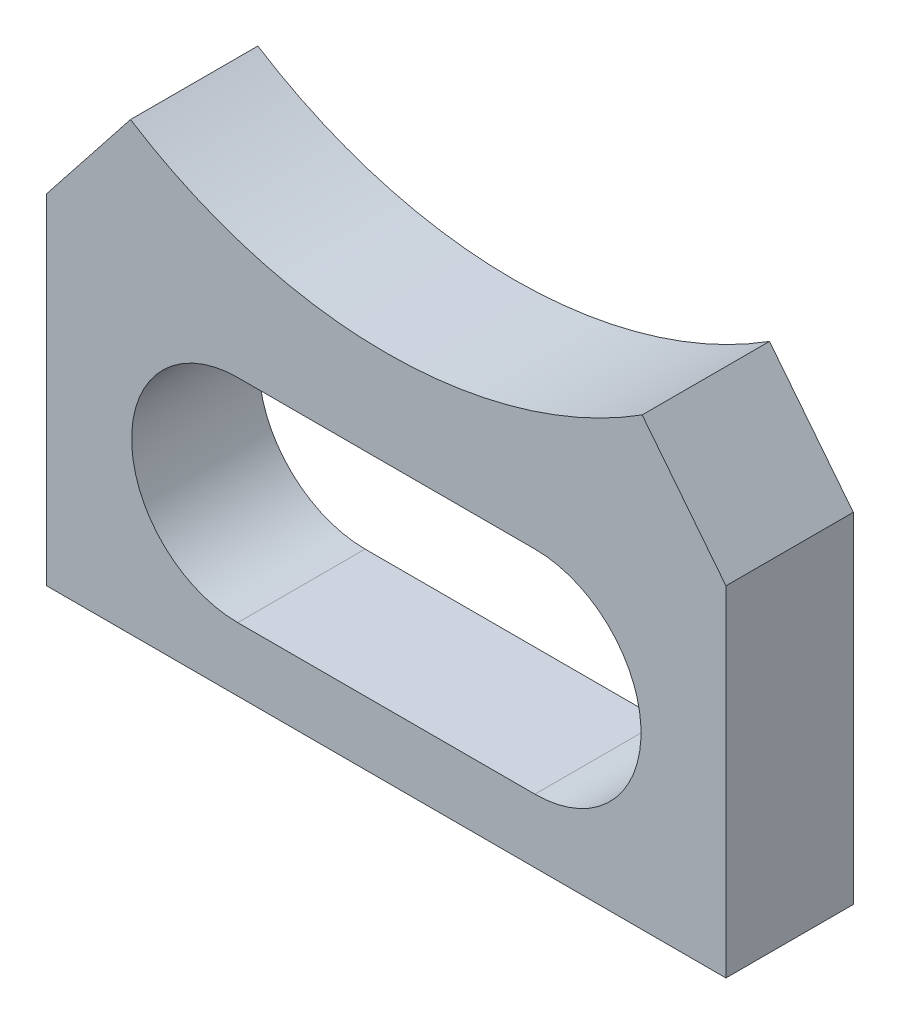
ISO-10303-21;
HEADER;
FILE_DESCRIPTION(('STEP AP214'),'2;1');
FILE_NAME('part.step','',(''),(''),'','','');
FILE_SCHEMA(('AUTOMOTIVE_DESIGN { 1 0 10303 214 1 1 1 1 }'));
ENDSEC;
DATA;
#1=APPLICATION_CONTEXT('core data for automotive mechanical design processes');
#2=APPLICATION_PROTOCOL_DEFINITION('international standard','automotive_design',2000,#1);
#3=PRODUCT_CONTEXT('',#1,'mechanical');
#4=PRODUCT('Part','Part','',(#3));
#5=PRODUCT_RELATED_PRODUCT_CATEGORY('part','',(#4));
#6=PRODUCT_DEFINITION_FORMATION('','',#4);
#7=PRODUCT_DEFINITION_CONTEXT('part definition',#1,'design');
#8=PRODUCT_DEFINITION('design','',#6,#7);
#9=PRODUCT_DEFINITION_SHAPE('','',#8);
#10=(LENGTH_UNIT() NAMED_UNIT(*) SI_UNIT(.MILLI.,.METRE.));
#11=(NAMED_UNIT(*) PLANE_ANGLE_UNIT() SI_UNIT($,.RADIAN.));
#12=(NAMED_UNIT(*) SI_UNIT($,.STERADIAN.) SOLID_ANGLE_UNIT());
#13=UNCERTAINTY_MEASURE_WITH_UNIT(LENGTH_MEASURE(1.E-05),#10,'distance_accuracy_value','');
#14=(GEOMETRIC_REPRESENTATION_CONTEXT(3) GLOBAL_UNCERTAINTY_ASSIGNED_CONTEXT((#13)) GLOBAL_UNIT_ASSIGNED_CONTEXT((#10,
#11,#12)) REPRESENTATION_CONTEXT('',''));
#15=CARTESIAN_POINT('',(0.,0.,0.));
#16=DIRECTION('',(0.,0.,1.));
#17=DIRECTION('',(1.,0.,0.));
#18=AXIS2_PLACEMENT_3D('',#15,#16,#17);
#19=CARTESIAN_POINT('',(-16.,0.,-6.));
#20=DIRECTION('',(-1.,0.,0.));
#21=DIRECTION('',(0.,0.,1.));
#22=AXIS2_PLACEMENT_3D('',#19,#20,#21);
#23=PLANE('',#22);
#24=DIRECTION('',(0.,-1.,0.));
#25=VECTOR('',#24,1.);
#26=CARTESIAN_POINT('',(-16.,0.,0.));
#27=LINE('',#26,#25);
#28=CARTESIAN_POINT('',(-16.,16.,0.));
#29=VERTEX_POINT('',#28);
#30=CARTESIAN_POINT('',(-16.,0.,0.));
#31=VERTEX_POINT('',#30);
#32=EDGE_CURVE('E146',#29,#31,#27,.T.);
#33=ORIENTED_EDGE('',*,*,#32,.F.);
#34=DIRECTION('',(0.,0.,1.));
#35=VECTOR('',#34,1.);
#36=CARTESIAN_POINT('',(-16.,16.,-6.));
#37=LINE('',#36,#35);
#38=CARTESIAN_POINT('',(-16.,16.,-6.));
#39=VERTEX_POINT('',#38);
#40=EDGE_CURVE('E11',#39,#29,#37,.T.);
#41=ORIENTED_EDGE('',*,*,#40,.F.);
#42=DIRECTION('',(0.,-1.,0.));
#43=VECTOR('',#42,1.);
#44=CARTESIAN_POINT('',(-16.,0.,-6.));
#45=LINE('',#44,#43);
#46=CARTESIAN_POINT('',(-16.,0.,-6.));
#47=VERTEX_POINT('',#46);
#48=EDGE_CURVE('E150',#39,#47,#45,.T.);
#49=ORIENTED_EDGE('',*,*,#48,.T.);
#50=DIRECTION('',(0.,0.,1.));
#51=VECTOR('',#50,1.);
#52=CARTESIAN_POINT('',(-16.,0.,-6.));
#53=LINE('',#52,#51);
#54=EDGE_CURVE('E39',#47,#31,#53,.T.);
#55=ORIENTED_EDGE('',*,*,#54,.T.);
#56=EDGE_LOOP('',(#33,#41,#49,#55));
#57=FACE_BOUND('',#56,.T.);
#58=ADVANCED_FACE('F36',(#57),#23,.T.);
#59=CARTESIAN_POINT('',(-16.,16.,-6.));
#60=DIRECTION('',(-0.784832318320194,0.619708183034685,0.));
#61=DIRECTION('',(-0.619708183034685,-0.784832318320194,0.));
#62=AXIS2_PLACEMENT_3D('',#59,#60,#61);
#63=PLANE('',#62);
#64=DIRECTION('',(-0.619708183034685,-0.784832318320194,0.));
#65=VECTOR('',#64,1.);
#66=CARTESIAN_POINT('',(-16.,16.,0.));
#67=LINE('',#66,#65);
#68=CARTESIAN_POINT('',(-12.051970793194,21.,0.));
#69=VERTEX_POINT('',#68);
#70=EDGE_CURVE('E154',#69,#29,#67,.T.);
#71=ORIENTED_EDGE('',*,*,#70,.F.);
#72=DIRECTION('',(0.,0.,1.));
#73=VECTOR('',#72,1.);
#74=CARTESIAN_POINT('',(-12.051970793194,21.,-6.));
#75=LINE('',#74,#73);
#76=CARTESIAN_POINT('',(-12.051970793194,21.,-6.));
#77=VERTEX_POINT('',#76);
#78=EDGE_CURVE('E44',#77,#69,#75,.T.);
#79=ORIENTED_EDGE('',*,*,#78,.F.);
#80=DIRECTION('',(-0.619708183034685,-0.784832318320194,0.));
#81=VECTOR('',#80,1.);
#82=CARTESIAN_POINT('',(-16.,16.,-6.));
#83=LINE('',#82,#81);
#84=EDGE_CURVE('E166',#77,#39,#83,.T.);
#85=ORIENTED_EDGE('',*,*,#84,.T.);
#86=ORIENTED_EDGE('',*,*,#40,.T.);
#87=EDGE_LOOP('',(#71,#79,#85,#86));
#88=FACE_BOUND('',#87,.T.);
#89=ADVANCED_FACE('F203',(#88),#63,.T.);
#90=CARTESIAN_POINT('',(0.,40.,-6.));
#91=DIRECTION('',(0.,0.,1.));
#92=DIRECTION('',(1.,0.,0.));
#93=AXIS2_PLACEMENT_3D('',#90,#91,#92);
#94=CYLINDRICAL_SURFACE('',#93,22.5);
#95=CARTESIAN_POINT('',(0.,40.,0.));
#96=DIRECTION('',(0.,0.,-1.));
#97=DIRECTION('',(1.,0.,0.));
#98=AXIS2_PLACEMENT_3D('',#95,#96,#97);
#99=CIRCLE('',#98,22.5);
#100=CARTESIAN_POINT('',(12.051970793194,21.,0.));
#101=VERTEX_POINT('',#100);
#102=EDGE_CURVE('E180',#101,#69,#99,.T.);
#103=ORIENTED_EDGE('',*,*,#102,.F.);
#104=DIRECTION('',(0.,0.,1.));
#105=VECTOR('',#104,1.);
#106=CARTESIAN_POINT('',(12.051970793194,21.,-6.));
#107=LINE('',#106,#105);
#108=CARTESIAN_POINT('',(12.051970793194,21.,-6.));
#109=VERTEX_POINT('',#108);
#110=EDGE_CURVE('E186',#109,#101,#107,.T.);
#111=ORIENTED_EDGE('',*,*,#110,.F.);
#112=CARTESIAN_POINT('',(0.,40.,-6.));
#113=DIRECTION('',(0.,0.,-1.));
#114=DIRECTION('',(1.,0.,0.));
#115=AXIS2_PLACEMENT_3D('',#112,#113,#114);
#116=CIRCLE('',#115,22.5);
#117=EDGE_CURVE('E163',#109,#77,#116,.T.);
#118=ORIENTED_EDGE('',*,*,#117,.T.);
#119=ORIENTED_EDGE('',*,*,#78,.T.);
#120=EDGE_LOOP('',(#103,#111,#118,#119));
#121=FACE_BOUND('',#120,.T.);
#122=ADVANCED_FACE('F214',(#121),#94,.F.);
#123=CARTESIAN_POINT('',(16.,16.,-6.));
#124=DIRECTION('',(0.784832318320194,0.619708183034685,0.));
#125=DIRECTION('',(-0.619708183034685,0.784832318320194,0.));
#126=AXIS2_PLACEMENT_3D('',#123,#124,#125);
#127=PLANE('',#126);
#128=DIRECTION('',(-0.619708183034685,0.784832318320194,0.));
#129=VECTOR('',#128,1.);
#130=CARTESIAN_POINT('',(16.,16.,0.));
#131=LINE('',#130,#129);
#132=CARTESIAN_POINT('',(16.,16.,0.));
#133=VERTEX_POINT('',#132);
#134=EDGE_CURVE('E177',#133,#101,#131,.T.);
#135=ORIENTED_EDGE('',*,*,#134,.F.);
#136=DIRECTION('',(0.,0.,1.));
#137=VECTOR('',#136,1.);
#138=CARTESIAN_POINT('',(16.,16.,-6.));
#139=LINE('',#138,#137);
#140=CARTESIAN_POINT('',(16.,16.,-6.));
#141=VERTEX_POINT('',#140);
#142=EDGE_CURVE('E188',#141,#133,#139,.T.);
#143=ORIENTED_EDGE('',*,*,#142,.F.);
#144=DIRECTION('',(-0.619708183034685,0.784832318320194,0.));
#145=VECTOR('',#144,1.);
#146=CARTESIAN_POINT('',(16.,16.,-6.));
#147=LINE('',#146,#145);
#148=EDGE_CURVE('E160',#141,#109,#147,.T.);
#149=ORIENTED_EDGE('',*,*,#148,.T.);
#150=ORIENTED_EDGE('',*,*,#110,.T.);
#151=EDGE_LOOP('',(#135,#143,#149,#150));
#152=FACE_BOUND('',#151,.T.);
#153=ADVANCED_FACE('F212',(#152),#127,.T.);
#154=CARTESIAN_POINT('',(16.,16.,-6.));
#155=DIRECTION('',(1.,0.,0.));
#156=DIRECTION('',(0.,0.,-1.));
#157=AXIS2_PLACEMENT_3D('',#154,#155,#156);
#158=PLANE('',#157);
#159=DIRECTION('',(0.,1.,0.));
#160=VECTOR('',#159,1.);
#161=CARTESIAN_POINT('',(16.,16.,0.));
#162=LINE('',#161,#160);
#163=CARTESIAN_POINT('',(16.,0.,0.));
#164=VERTEX_POINT('',#163);
#165=EDGE_CURVE('E174',#164,#133,#162,.T.);
#166=ORIENTED_EDGE('',*,*,#165,.F.);
#167=DIRECTION('',(0.,0.,1.));
#168=VECTOR('',#167,1.);
#169=CARTESIAN_POINT('',(16.,0.,-6.));
#170=LINE('',#169,#168);
#171=CARTESIAN_POINT('',(16.,0.,-6.));
#172=VERTEX_POINT('',#171);
#173=EDGE_CURVE('E189',#172,#164,#170,.T.);
#174=ORIENTED_EDGE('',*,*,#173,.F.);
#175=DIRECTION('',(0.,1.,0.));
#176=VECTOR('',#175,1.);
#177=CARTESIAN_POINT('',(16.,16.,-6.));
#178=LINE('',#177,#176);
#179=EDGE_CURVE('E157',#172,#141,#178,.T.);
#180=ORIENTED_EDGE('',*,*,#179,.T.);
#181=ORIENTED_EDGE('',*,*,#142,.T.);
#182=EDGE_LOOP('',(#166,#174,#180,#181));
#183=FACE_BOUND('',#182,.T.);
#184=ADVANCED_FACE('F209',(#183),#158,.T.);
#185=CARTESIAN_POINT('',(-16.,0.,-6.));
#186=DIRECTION('',(0.,-1.,0.));
#187=DIRECTION('',(1.,0.,0.));
#188=AXIS2_PLACEMENT_3D('',#185,#186,#187);
#189=PLANE('',#188);
#190=DIRECTION('',(1.,0.,0.));
#191=VECTOR('',#190,1.);
#192=CARTESIAN_POINT('',(-16.,0.,0.));
#193=LINE('',#192,#191);
#194=EDGE_CURVE('E171',#31,#164,#193,.T.);
#195=ORIENTED_EDGE('',*,*,#194,.F.);
#196=ORIENTED_EDGE('',*,*,#54,.F.);
#197=DIRECTION('',(1.,0.,0.));
#198=VECTOR('',#197,1.);
#199=CARTESIAN_POINT('',(-16.,0.,-6.));
#200=LINE('',#199,#198);
#201=EDGE_CURVE('E153',#47,#172,#200,.T.);
#202=ORIENTED_EDGE('',*,*,#201,.T.);
#203=ORIENTED_EDGE('',*,*,#173,.T.);
#204=EDGE_LOOP('',(#195,#196,#202,#203));
#205=FACE_BOUND('',#204,.T.);
#206=ADVANCED_FACE('F197',(#205),#189,.T.);
#207=CARTESIAN_POINT('',(0.,40.,-6.));
#208=DIRECTION('',(0.,0.,1.));
#209=DIRECTION('',(1.,0.,0.));
#210=AXIS2_PLACEMENT_3D('',#207,#208,#209);
#211=PLANE('',#210);
#212=DIRECTION('',(-1.,0.,0.));
#213=VECTOR('',#212,1.);
#214=CARTESIAN_POINT('',(-6.99999999999999,13.,-6.));
#215=LINE('',#214,#213);
#216=CARTESIAN_POINT('',(7.00000000000001,13.,-6.));
#217=VERTEX_POINT('',#216);
#218=CARTESIAN_POINT('',(-6.99999999999999,13.,-6.));
#219=VERTEX_POINT('',#218);
#220=EDGE_CURVE('E121',#217,#219,#215,.T.);
#221=ORIENTED_EDGE('',*,*,#220,.T.);
#222=CARTESIAN_POINT('',(-6.99999999999999,8.,-6.));
#223=DIRECTION('',(0.,0.,1.));
#224=DIRECTION('',(1.,0.,0.));
#225=AXIS2_PLACEMENT_3D('',#222,#223,#224);
#226=CIRCLE('',#225,5.);
#227=CARTESIAN_POINT('',(-6.99999999999999,3.,-6.));
#228=VERTEX_POINT('',#227);
#229=EDGE_CURVE('E115',#219,#228,#226,.T.);
#230=ORIENTED_EDGE('',*,*,#229,.T.);
#231=DIRECTION('',(1.,0.,0.));
#232=VECTOR('',#231,1.);
#233=CARTESIAN_POINT('',(-6.99999999999999,3.,-6.));
#234=LINE('',#233,#232);
#235=CARTESIAN_POINT('',(7.00000000000001,3.,-6.));
#236=VERTEX_POINT('',#235);
#237=EDGE_CURVE('E124',#228,#236,#234,.T.);
#238=ORIENTED_EDGE('',*,*,#237,.T.);
#239=CARTESIAN_POINT('',(7.00000000000001,8.,-6.));
#240=DIRECTION('',(0.,0.,1.));
#241=DIRECTION('',(1.,0.,0.));
#242=AXIS2_PLACEMENT_3D('',#239,#240,#241);
#243=CIRCLE('',#242,5.);
#244=EDGE_CURVE('E52',#236,#217,#243,.T.);
#245=ORIENTED_EDGE('',*,*,#244,.T.);
#246=EDGE_LOOP('',(#221,#230,#238,#245));
#247=FACE_BOUND('',#246,.T.);
#248=ORIENTED_EDGE('',*,*,#48,.F.);
#249=ORIENTED_EDGE('',*,*,#84,.F.);
#250=ORIENTED_EDGE('',*,*,#117,.F.);
#251=ORIENTED_EDGE('',*,*,#148,.F.);
#252=ORIENTED_EDGE('',*,*,#179,.F.);
#253=ORIENTED_EDGE('',*,*,#201,.F.);
#254=EDGE_LOOP('',(#248,#249,#250,#251,#252,#253));
#255=FACE_BOUND('',#254,.T.);
#256=ADVANCED_FACE('F128',(#247,#255),#211,.F.);
#257=CARTESIAN_POINT('',(0.,40.,0.));
#258=DIRECTION('',(0.,0.,1.));
#259=DIRECTION('',(1.,0.,0.));
#260=AXIS2_PLACEMENT_3D('',#257,#258,#259);
#261=PLANE('',#260);
#262=CARTESIAN_POINT('',(-6.99999999999999,8.,0.));
#263=DIRECTION('',(0.,0.,1.));
#264=DIRECTION('',(1.,0.,0.));
#265=AXIS2_PLACEMENT_3D('',#262,#263,#264);
#266=CIRCLE('',#265,5.);
#267=CARTESIAN_POINT('',(-6.99999999999999,13.,0.));
#268=VERTEX_POINT('',#267);
#269=CARTESIAN_POINT('',(-6.99999999999999,3.,0.));
#270=VERTEX_POINT('',#269);
#271=EDGE_CURVE('E60',#268,#270,#266,.T.);
#272=ORIENTED_EDGE('',*,*,#271,.F.);
#273=DIRECTION('',(-1.,0.,0.));
#274=VECTOR('',#273,1.);
#275=CARTESIAN_POINT('',(-6.99999999999999,13.,0.));
#276=LINE('',#275,#274);
#277=CARTESIAN_POINT('',(7.00000000000001,13.,0.));
#278=VERTEX_POINT('',#277);
#279=EDGE_CURVE('E131',#278,#268,#276,.T.);
#280=ORIENTED_EDGE('',*,*,#279,.F.);
#281=CARTESIAN_POINT('',(7.00000000000001,8.,0.));
#282=DIRECTION('',(0.,0.,1.));
#283=DIRECTION('',(1.,0.,0.));
#284=AXIS2_PLACEMENT_3D('',#281,#282,#283);
#285=CIRCLE('',#284,5.);
#286=CARTESIAN_POINT('',(7.00000000000001,3.,0.));
#287=VERTEX_POINT('',#286);
#288=EDGE_CURVE('E134',#287,#278,#285,.T.);
#289=ORIENTED_EDGE('',*,*,#288,.F.);
#290=DIRECTION('',(1.,0.,0.));
#291=VECTOR('',#290,1.);
#292=CARTESIAN_POINT('',(-6.99999999999999,3.,0.));
#293=LINE('',#292,#291);
#294=EDGE_CURVE('E140',#270,#287,#293,.T.);
#295=ORIENTED_EDGE('',*,*,#294,.F.);
#296=EDGE_LOOP('',(#272,#280,#289,#295));
#297=FACE_BOUND('',#296,.T.);
#298=ORIENTED_EDGE('',*,*,#32,.T.);
#299=ORIENTED_EDGE('',*,*,#194,.T.);
#300=ORIENTED_EDGE('',*,*,#165,.T.);
#301=ORIENTED_EDGE('',*,*,#134,.T.);
#302=ORIENTED_EDGE('',*,*,#102,.T.);
#303=ORIENTED_EDGE('',*,*,#70,.T.);
#304=EDGE_LOOP('',(#298,#299,#300,#301,#302,#303));
#305=FACE_BOUND('',#304,.T.);
#306=ADVANCED_FACE('F199',(#297,#305),#261,.T.);
#307=CARTESIAN_POINT('',(-6.99999999999999,8.,-6.));
#308=DIRECTION('',(0.,0.,1.));
#309=DIRECTION('',(1.,0.,0.));
#310=AXIS2_PLACEMENT_3D('',#307,#308,#309);
#311=CYLINDRICAL_SURFACE('',#310,5.);
#312=ORIENTED_EDGE('',*,*,#271,.T.);
#313=DIRECTION('',(0.,0.,1.));
#314=VECTOR('',#313,1.);
#315=CARTESIAN_POINT('',(-6.99999999999999,3.,-6.));
#316=LINE('',#315,#314);
#317=EDGE_CURVE('E111',#228,#270,#316,.T.);
#318=ORIENTED_EDGE('',*,*,#317,.F.);
#319=ORIENTED_EDGE('',*,*,#229,.F.);
#320=DIRECTION('',(0.,0.,1.));
#321=VECTOR('',#320,1.);
#322=CARTESIAN_POINT('',(-6.99999999999999,13.,-6.));
#323=LINE('',#322,#321);
#324=EDGE_CURVE('E144',#219,#268,#323,.T.);
#325=ORIENTED_EDGE('',*,*,#324,.T.);
#326=EDGE_LOOP('',(#312,#318,#319,#325));
#327=FACE_BOUND('',#326,.T.);
#328=ADVANCED_FACE('F113',(#327),#311,.F.);
#329=CARTESIAN_POINT('',(-6.99999999999999,13.,-6.));
#330=DIRECTION('',(0.,1.,0.));
#331=DIRECTION('',(0.,0.,1.));
#332=AXIS2_PLACEMENT_3D('',#329,#330,#331);
#333=PLANE('',#332);
#334=ORIENTED_EDGE('',*,*,#279,.T.);
#335=ORIENTED_EDGE('',*,*,#324,.F.);
#336=ORIENTED_EDGE('',*,*,#220,.F.);
#337=DIRECTION('',(0.,0.,1.));
#338=VECTOR('',#337,1.);
#339=CARTESIAN_POINT('',(7.00000000000001,13.,-6.));
#340=LINE('',#339,#338);
#341=EDGE_CURVE('E147',#217,#278,#340,.T.);
#342=ORIENTED_EDGE('',*,*,#341,.T.);
#343=EDGE_LOOP('',(#334,#335,#336,#342));
#344=FACE_BOUND('',#343,.T.);
#345=ADVANCED_FACE('F281',(#344),#333,.F.);
#346=CARTESIAN_POINT('',(7.00000000000001,8.,-6.));
#347=DIRECTION('',(0.,0.,1.));
#348=DIRECTION('',(1.,0.,0.));
#349=AXIS2_PLACEMENT_3D('',#346,#347,#348);
#350=CYLINDRICAL_SURFACE('',#349,5.);
#351=ORIENTED_EDGE('',*,*,#288,.T.);
#352=ORIENTED_EDGE('',*,*,#341,.F.);
#353=ORIENTED_EDGE('',*,*,#244,.F.);
#354=DIRECTION('',(0.,0.,1.));
#355=VECTOR('',#354,1.);
#356=CARTESIAN_POINT('',(7.00000000000001,3.,-6.));
#357=LINE('',#356,#355);
#358=EDGE_CURVE('E120',#236,#287,#357,.T.);
#359=ORIENTED_EDGE('',*,*,#358,.T.);
#360=EDGE_LOOP('',(#351,#352,#353,#359));
#361=FACE_BOUND('',#360,.T.);
#362=ADVANCED_FACE('F290',(#361),#350,.F.);
#363=CARTESIAN_POINT('',(-6.99999999999999,3.,-6.));
#364=DIRECTION('',(0.,-1.,0.));
#365=DIRECTION('',(0.,0.,-1.));
#366=AXIS2_PLACEMENT_3D('',#363,#364,#365);
#367=PLANE('',#366);
#368=ORIENTED_EDGE('',*,*,#294,.T.);
#369=ORIENTED_EDGE('',*,*,#358,.F.);
#370=ORIENTED_EDGE('',*,*,#237,.F.);
#371=ORIENTED_EDGE('',*,*,#317,.T.);
#372=EDGE_LOOP('',(#368,#369,#370,#371));
#373=FACE_BOUND('',#372,.T.);
#374=ADVANCED_FACE('F125',(#373),#367,.F.);
#375=CLOSED_SHELL('',(#58,#89,#122,#153,#184,#206,#256,#306,#328,#345,#362,#374));
#376=MANIFOLD_SOLID_BREP('B2',#375);
#377=ADVANCED_BREP_SHAPE_REPRESENTATION('',(#18,#376),#14);
#378=SHAPE_DEFINITION_REPRESENTATION(#9,#377);
ENDSEC;
END-ISO-10303-21;
